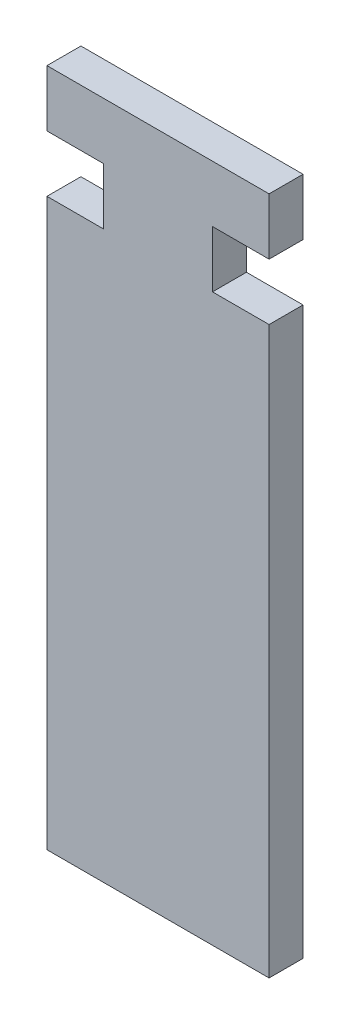
ISO-10303-21;
HEADER;
FILE_DESCRIPTION(('STEP AP214'),'2;1');
FILE_NAME('part.step','',(''),(''),'','','');
FILE_SCHEMA(('AUTOMOTIVE_DESIGN { 1 0 10303 214 1 1 1 1 }'));
ENDSEC;
DATA;
#1=APPLICATION_CONTEXT('core data for automotive mechanical design processes');
#2=APPLICATION_PROTOCOL_DEFINITION('international standard','automotive_design',2000,#1);
#3=PRODUCT_CONTEXT('',#1,'mechanical');
#4=PRODUCT('Part','Part','',(#3));
#5=PRODUCT_RELATED_PRODUCT_CATEGORY('part','',(#4));
#6=PRODUCT_DEFINITION_FORMATION('','',#4);
#7=PRODUCT_DEFINITION_CONTEXT('part definition',#1,'design');
#8=PRODUCT_DEFINITION('design','',#6,#7);
#9=PRODUCT_DEFINITION_SHAPE('','',#8);
#10=(LENGTH_UNIT() NAMED_UNIT(*) SI_UNIT(.MILLI.,.METRE.));
#11=(NAMED_UNIT(*) PLANE_ANGLE_UNIT() SI_UNIT($,.RADIAN.));
#12=(NAMED_UNIT(*) SI_UNIT($,.STERADIAN.) SOLID_ANGLE_UNIT());
#13=UNCERTAINTY_MEASURE_WITH_UNIT(LENGTH_MEASURE(1.E-05),#10,'distance_accuracy_value','');
#14=(GEOMETRIC_REPRESENTATION_CONTEXT(3) GLOBAL_UNCERTAINTY_ASSIGNED_CONTEXT((#13)) GLOBAL_UNIT_ASSIGNED_CONTEXT((#10,
#11,#12)) REPRESENTATION_CONTEXT('',''));
#15=CARTESIAN_POINT('',(0.,0.,0.));
#16=DIRECTION('',(0.,0.,1.));
#17=DIRECTION('',(1.,0.,0.));
#18=AXIS2_PLACEMENT_3D('',#15,#16,#17);
#19=CARTESIAN_POINT('',(1.57,0.,0.24));
#20=DIRECTION('',(0.,1.,0.));
#21=DIRECTION('',(-1.,0.,0.));
#22=AXIS2_PLACEMENT_3D('',#19,#20,#21);
#23=PLANE('',#22);
#24=DIRECTION('',(1.,0.,0.));
#25=VECTOR('',#24,1.);
#26=CARTESIAN_POINT('',(1.57,0.,0.));
#27=LINE('',#26,#25);
#28=CARTESIAN_POINT('',(0.,0.,0.));
#29=VERTEX_POINT('',#28);
#30=CARTESIAN_POINT('',(1.57,0.,0.));
#31=VERTEX_POINT('',#30);
#32=EDGE_CURVE('E153',#29,#31,#27,.T.);
#33=ORIENTED_EDGE('',*,*,#32,.T.);
#34=DIRECTION('',(0.,0.,-1.));
#35=VECTOR('',#34,1.);
#36=CARTESIAN_POINT('',(1.57,0.,0.24));
#37=LINE('',#36,#35);
#38=CARTESIAN_POINT('',(1.57,0.,0.24));
#39=VERTEX_POINT('',#38);
#40=EDGE_CURVE('E11',#39,#31,#37,.T.);
#41=ORIENTED_EDGE('',*,*,#40,.F.);
#42=DIRECTION('',(1.,0.,0.));
#43=VECTOR('',#42,1.);
#44=CARTESIAN_POINT('',(1.57,0.,0.24));
#45=LINE('',#44,#43);
#46=CARTESIAN_POINT('',(0.,0.,0.24));
#47=VERTEX_POINT('',#46);
#48=EDGE_CURVE('E175',#47,#39,#45,.T.);
#49=ORIENTED_EDGE('',*,*,#48,.F.);
#50=DIRECTION('',(0.,0.,-1.));
#51=VECTOR('',#50,1.);
#52=CARTESIAN_POINT('',(0.,0.,0.24));
#53=LINE('',#52,#51);
#54=EDGE_CURVE('E149',#47,#29,#53,.T.);
#55=ORIENTED_EDGE('',*,*,#54,.T.);
#56=EDGE_LOOP('',(#33,#41,#49,#55));
#57=FACE_BOUND('',#56,.T.);
#58=ADVANCED_FACE('F33',(#57),#23,.F.);
#59=CARTESIAN_POINT('',(1.57,4.,0.24));
#60=DIRECTION('',(-1.,0.,0.));
#61=DIRECTION('',(0.,0.,1.));
#62=AXIS2_PLACEMENT_3D('',#59,#60,#61);
#63=PLANE('',#62);
#64=DIRECTION('',(0.,1.,0.));
#65=VECTOR('',#64,1.);
#66=CARTESIAN_POINT('',(1.57,4.,0.));
#67=LINE('',#66,#65);
#68=CARTESIAN_POINT('',(1.57,4.,0.));
#69=VERTEX_POINT('',#68);
#70=EDGE_CURVE('E156',#31,#69,#67,.T.);
#71=ORIENTED_EDGE('',*,*,#70,.T.);
#72=DIRECTION('',(0.,0.,-1.));
#73=VECTOR('',#72,1.);
#74=CARTESIAN_POINT('',(1.57,4.,0.24));
#75=LINE('',#74,#73);
#76=CARTESIAN_POINT('',(1.57,4.,0.24));
#77=VERTEX_POINT('',#76);
#78=EDGE_CURVE('E41',#77,#69,#75,.T.);
#79=ORIENTED_EDGE('',*,*,#78,.F.);
#80=DIRECTION('',(0.,1.,0.));
#81=VECTOR('',#80,1.);
#82=CARTESIAN_POINT('',(1.57,4.,0.24));
#83=LINE('',#82,#81);
#84=EDGE_CURVE('E104',#39,#77,#83,.T.);
#85=ORIENTED_EDGE('',*,*,#84,.F.);
#86=ORIENTED_EDGE('',*,*,#40,.T.);
#87=EDGE_LOOP('',(#71,#79,#85,#86));
#88=FACE_BOUND('',#87,.T.);
#89=ADVANCED_FACE('F253',(#88),#63,.F.);
#90=CARTESIAN_POINT('',(1.17,4.,0.24));
#91=DIRECTION('',(0.,-1.,0.));
#92=DIRECTION('',(0.,0.,-1.));
#93=AXIS2_PLACEMENT_3D('',#90,#91,#92);
#94=PLANE('',#93);
#95=DIRECTION('',(-1.,0.,0.));
#96=VECTOR('',#95,1.);
#97=CARTESIAN_POINT('',(1.17,4.,0.));
#98=LINE('',#97,#96);
#99=CARTESIAN_POINT('',(1.17,4.,0.));
#100=VERTEX_POINT('',#99);
#101=EDGE_CURVE('E158',#69,#100,#98,.T.);
#102=ORIENTED_EDGE('',*,*,#101,.T.);
#103=DIRECTION('',(0.,0.,-1.));
#104=VECTOR('',#103,1.);
#105=CARTESIAN_POINT('',(1.17,4.,0.24));
#106=LINE('',#105,#104);
#107=CARTESIAN_POINT('',(1.17,4.,0.24));
#108=VERTEX_POINT('',#107);
#109=EDGE_CURVE('E194',#108,#100,#106,.T.);
#110=ORIENTED_EDGE('',*,*,#109,.F.);
#111=DIRECTION('',(-1.,0.,0.));
#112=VECTOR('',#111,1.);
#113=CARTESIAN_POINT('',(1.17,4.,0.24));
#114=LINE('',#113,#112);
#115=EDGE_CURVE('E202',#77,#108,#114,.T.);
#116=ORIENTED_EDGE('',*,*,#115,.F.);
#117=ORIENTED_EDGE('',*,*,#78,.T.);
#118=EDGE_LOOP('',(#102,#110,#116,#117));
#119=FACE_BOUND('',#118,.T.);
#120=ADVANCED_FACE('F200',(#119),#94,.F.);
#121=CARTESIAN_POINT('',(1.17,4.4,0.24));
#122=DIRECTION('',(-1.,0.,0.));
#123=DIRECTION('',(0.,0.,1.));
#124=AXIS2_PLACEMENT_3D('',#121,#122,#123);
#125=PLANE('',#124);
#126=DIRECTION('',(0.,1.,0.));
#127=VECTOR('',#126,1.);
#128=CARTESIAN_POINT('',(1.17,4.4,0.));
#129=LINE('',#128,#127);
#130=CARTESIAN_POINT('',(1.17,4.4,0.));
#131=VERTEX_POINT('',#130);
#132=EDGE_CURVE('E160',#100,#131,#129,.T.);
#133=ORIENTED_EDGE('',*,*,#132,.T.);
#134=DIRECTION('',(0.,0.,-1.));
#135=VECTOR('',#134,1.);
#136=CARTESIAN_POINT('',(1.17,4.4,0.24));
#137=LINE('',#136,#135);
#138=CARTESIAN_POINT('',(1.17,4.4,0.24));
#139=VERTEX_POINT('',#138);
#140=EDGE_CURVE('E191',#139,#131,#137,.T.);
#141=ORIENTED_EDGE('',*,*,#140,.F.);
#142=DIRECTION('',(0.,1.,0.));
#143=VECTOR('',#142,1.);
#144=CARTESIAN_POINT('',(1.17,4.4,0.24));
#145=LINE('',#144,#143);
#146=EDGE_CURVE('E220',#108,#139,#145,.T.);
#147=ORIENTED_EDGE('',*,*,#146,.F.);
#148=ORIENTED_EDGE('',*,*,#109,.T.);
#149=EDGE_LOOP('',(#133,#141,#147,#148));
#150=FACE_BOUND('',#149,.T.);
#151=ADVANCED_FACE('F211',(#150),#125,.F.);
#152=CARTESIAN_POINT('',(1.57,4.4,0.24));
#153=DIRECTION('',(0.,1.,0.));
#154=DIRECTION('',(0.,0.,1.));
#155=AXIS2_PLACEMENT_3D('',#152,#153,#154);
#156=PLANE('',#155);
#157=DIRECTION('',(1.,0.,0.));
#158=VECTOR('',#157,1.);
#159=CARTESIAN_POINT('',(1.57,4.4,0.));
#160=LINE('',#159,#158);
#161=CARTESIAN_POINT('',(1.57,4.4,0.));
#162=VERTEX_POINT('',#161);
#163=EDGE_CURVE('E162',#131,#162,#160,.T.);
#164=ORIENTED_EDGE('',*,*,#163,.T.);
#165=DIRECTION('',(0.,0.,-1.));
#166=VECTOR('',#165,1.);
#167=CARTESIAN_POINT('',(1.57,4.4,0.24));
#168=LINE('',#167,#166);
#169=CARTESIAN_POINT('',(1.57,4.4,0.24));
#170=VERTEX_POINT('',#169);
#171=EDGE_CURVE('E188',#170,#162,#168,.T.);
#172=ORIENTED_EDGE('',*,*,#171,.F.);
#173=DIRECTION('',(1.,0.,0.));
#174=VECTOR('',#173,1.);
#175=CARTESIAN_POINT('',(1.57,4.4,0.24));
#176=LINE('',#175,#174);
#177=EDGE_CURVE('E217',#139,#170,#176,.T.);
#178=ORIENTED_EDGE('',*,*,#177,.F.);
#179=ORIENTED_EDGE('',*,*,#140,.T.);
#180=EDGE_LOOP('',(#164,#172,#178,#179));
#181=FACE_BOUND('',#180,.T.);
#182=ADVANCED_FACE('F215',(#181),#156,.F.);
#183=CARTESIAN_POINT('',(1.57,4.8,0.24));
#184=DIRECTION('',(-1.,0.,0.));
#185=DIRECTION('',(0.,0.,1.));
#186=AXIS2_PLACEMENT_3D('',#183,#184,#185);
#187=PLANE('',#186);
#188=DIRECTION('',(0.,1.,0.));
#189=VECTOR('',#188,1.);
#190=CARTESIAN_POINT('',(1.57,4.8,0.));
#191=LINE('',#190,#189);
#192=CARTESIAN_POINT('',(1.57,4.8,0.));
#193=VERTEX_POINT('',#192);
#194=EDGE_CURVE('E164',#162,#193,#191,.T.);
#195=ORIENTED_EDGE('',*,*,#194,.T.);
#196=DIRECTION('',(0.,0.,-1.));
#197=VECTOR('',#196,1.);
#198=CARTESIAN_POINT('',(1.57,4.8,0.24));
#199=LINE('',#198,#197);
#200=CARTESIAN_POINT('',(1.57,4.8,0.24));
#201=VERTEX_POINT('',#200);
#202=EDGE_CURVE('E185',#201,#193,#199,.T.);
#203=ORIENTED_EDGE('',*,*,#202,.F.);
#204=DIRECTION('',(0.,1.,0.));
#205=VECTOR('',#204,1.);
#206=CARTESIAN_POINT('',(1.57,4.8,0.24));
#207=LINE('',#206,#205);
#208=EDGE_CURVE('E219',#170,#201,#207,.T.);
#209=ORIENTED_EDGE('',*,*,#208,.F.);
#210=ORIENTED_EDGE('',*,*,#171,.T.);
#211=EDGE_LOOP('',(#195,#203,#209,#210));
#212=FACE_BOUND('',#211,.T.);
#213=ADVANCED_FACE('F266',(#212),#187,.F.);
#214=CARTESIAN_POINT('',(0.,4.8,0.24));
#215=DIRECTION('',(0.,-1.,0.));
#216=DIRECTION('',(0.,0.,-1.));
#217=AXIS2_PLACEMENT_3D('',#214,#215,#216);
#218=PLANE('',#217);
#219=DIRECTION('',(-1.,0.,0.));
#220=VECTOR('',#219,1.);
#221=CARTESIAN_POINT('',(0.,4.8,0.));
#222=LINE('',#221,#220);
#223=CARTESIAN_POINT('',(0.,4.8,0.));
#224=VERTEX_POINT('',#223);
#225=EDGE_CURVE('E166',#193,#224,#222,.T.);
#226=ORIENTED_EDGE('',*,*,#225,.T.);
#227=DIRECTION('',(0.,0.,-1.));
#228=VECTOR('',#227,1.);
#229=CARTESIAN_POINT('',(0.,4.8,0.24));
#230=LINE('',#229,#228);
#231=CARTESIAN_POINT('',(0.,4.8,0.24));
#232=VERTEX_POINT('',#231);
#233=EDGE_CURVE('E182',#232,#224,#230,.T.);
#234=ORIENTED_EDGE('',*,*,#233,.F.);
#235=DIRECTION('',(-1.,0.,0.));
#236=VECTOR('',#235,1.);
#237=CARTESIAN_POINT('',(0.,4.8,0.24));
#238=LINE('',#237,#236);
#239=EDGE_CURVE('E222',#201,#232,#238,.T.);
#240=ORIENTED_EDGE('',*,*,#239,.F.);
#241=ORIENTED_EDGE('',*,*,#202,.T.);
#242=EDGE_LOOP('',(#226,#234,#240,#241));
#243=FACE_BOUND('',#242,.T.);
#244=ADVANCED_FACE('F269',(#243),#218,.F.);
#245=CARTESIAN_POINT('',(0.,4.4,0.24));
#246=DIRECTION('',(1.,0.,0.));
#247=DIRECTION('',(0.,0.,-1.));
#248=AXIS2_PLACEMENT_3D('',#245,#246,#247);
#249=PLANE('',#248);
#250=DIRECTION('',(0.,-1.,0.));
#251=VECTOR('',#250,1.);
#252=CARTESIAN_POINT('',(0.,4.4,0.));
#253=LINE('',#252,#251);
#254=CARTESIAN_POINT('',(0.,4.4,0.));
#255=VERTEX_POINT('',#254);
#256=EDGE_CURVE('E168',#224,#255,#253,.T.);
#257=ORIENTED_EDGE('',*,*,#256,.T.);
#258=DIRECTION('',(0.,0.,-1.));
#259=VECTOR('',#258,1.);
#260=CARTESIAN_POINT('',(0.,4.4,0.24));
#261=LINE('',#260,#259);
#262=CARTESIAN_POINT('',(0.,4.4,0.24));
#263=VERTEX_POINT('',#262);
#264=EDGE_CURVE('E179',#263,#255,#261,.T.);
#265=ORIENTED_EDGE('',*,*,#264,.F.);
#266=DIRECTION('',(0.,-1.,0.));
#267=VECTOR('',#266,1.);
#268=CARTESIAN_POINT('',(0.,4.4,0.24));
#269=LINE('',#268,#267);
#270=EDGE_CURVE('E228',#232,#263,#269,.T.);
#271=ORIENTED_EDGE('',*,*,#270,.F.);
#272=ORIENTED_EDGE('',*,*,#233,.T.);
#273=EDGE_LOOP('',(#257,#265,#271,#272));
#274=FACE_BOUND('',#273,.T.);
#275=ADVANCED_FACE('F234',(#274),#249,.F.);
#276=CARTESIAN_POINT('',(0.4,4.4,0.24));
#277=DIRECTION('',(0.,1.,0.));
#278=DIRECTION('',(0.,0.,1.));
#279=AXIS2_PLACEMENT_3D('',#276,#277,#278);
#280=PLANE('',#279);
#281=DIRECTION('',(1.,0.,0.));
#282=VECTOR('',#281,1.);
#283=CARTESIAN_POINT('',(0.4,4.4,0.));
#284=LINE('',#283,#282);
#285=CARTESIAN_POINT('',(0.4,4.4,0.));
#286=VERTEX_POINT('',#285);
#287=EDGE_CURVE('E170',#255,#286,#284,.T.);
#288=ORIENTED_EDGE('',*,*,#287,.T.);
#289=DIRECTION('',(0.,0.,-1.));
#290=VECTOR('',#289,1.);
#291=CARTESIAN_POINT('',(0.4,4.4,0.24));
#292=LINE('',#291,#290);
#293=CARTESIAN_POINT('',(0.4,4.4,0.24));
#294=VERTEX_POINT('',#293);
#295=EDGE_CURVE('E144',#294,#286,#292,.T.);
#296=ORIENTED_EDGE('',*,*,#295,.F.);
#297=DIRECTION('',(1.,0.,0.));
#298=VECTOR('',#297,1.);
#299=CARTESIAN_POINT('',(0.4,4.4,0.24));
#300=LINE('',#299,#298);
#301=EDGE_CURVE('E135',#263,#294,#300,.T.);
#302=ORIENTED_EDGE('',*,*,#301,.F.);
#303=ORIENTED_EDGE('',*,*,#264,.T.);
#304=EDGE_LOOP('',(#288,#296,#302,#303));
#305=FACE_BOUND('',#304,.T.);
#306=ADVANCED_FACE('F238',(#305),#280,.F.);
#307=CARTESIAN_POINT('',(0.4,4.,0.24));
#308=DIRECTION('',(1.,0.,0.));
#309=DIRECTION('',(0.,1.,0.));
#310=AXIS2_PLACEMENT_3D('',#307,#308,#309);
#311=PLANE('',#310);
#312=DIRECTION('',(0.,-1.,0.));
#313=VECTOR('',#312,1.);
#314=CARTESIAN_POINT('',(0.4,4.,0.));
#315=LINE('',#314,#313);
#316=CARTESIAN_POINT('',(0.4,4.,0.));
#317=VERTEX_POINT('',#316);
#318=EDGE_CURVE('E143',#286,#317,#315,.T.);
#319=ORIENTED_EDGE('',*,*,#318,.T.);
#320=DIRECTION('',(0.,0.,-1.));
#321=VECTOR('',#320,1.);
#322=CARTESIAN_POINT('',(0.4,4.,0.24));
#323=LINE('',#322,#321);
#324=CARTESIAN_POINT('',(0.4,4.,0.24));
#325=VERTEX_POINT('',#324);
#326=EDGE_CURVE('E140',#325,#317,#323,.T.);
#327=ORIENTED_EDGE('',*,*,#326,.F.);
#328=DIRECTION('',(0.,-1.,0.));
#329=VECTOR('',#328,1.);
#330=CARTESIAN_POINT('',(0.4,4.,0.24));
#331=LINE('',#330,#329);
#332=EDGE_CURVE('E129',#294,#325,#331,.T.);
#333=ORIENTED_EDGE('',*,*,#332,.F.);
#334=ORIENTED_EDGE('',*,*,#295,.T.);
#335=EDGE_LOOP('',(#319,#327,#333,#334));
#336=FACE_BOUND('',#335,.T.);
#337=ADVANCED_FACE('F141',(#336),#311,.F.);
#338=CARTESIAN_POINT('',(0.,4.,0.24));
#339=DIRECTION('',(0.,-1.,0.));
#340=DIRECTION('',(0.,0.,-1.));
#341=AXIS2_PLACEMENT_3D('',#338,#339,#340);
#342=PLANE('',#341);
#343=DIRECTION('',(-1.,0.,0.));
#344=VECTOR('',#343,1.);
#345=CARTESIAN_POINT('',(0.,4.,0.));
#346=LINE('',#345,#344);
#347=CARTESIAN_POINT('',(0.,4.,0.));
#348=VERTEX_POINT('',#347);
#349=EDGE_CURVE('E90',#317,#348,#346,.T.);
#350=ORIENTED_EDGE('',*,*,#349,.T.);
#351=DIRECTION('',(0.,0.,-1.));
#352=VECTOR('',#351,1.);
#353=CARTESIAN_POINT('',(0.,4.,0.24));
#354=LINE('',#353,#352);
#355=CARTESIAN_POINT('',(0.,4.,0.24));
#356=VERTEX_POINT('',#355);
#357=EDGE_CURVE('E145',#356,#348,#354,.T.);
#358=ORIENTED_EDGE('',*,*,#357,.F.);
#359=DIRECTION('',(-1.,0.,0.));
#360=VECTOR('',#359,1.);
#361=CARTESIAN_POINT('',(0.,4.,0.24));
#362=LINE('',#361,#360);
#363=EDGE_CURVE('E133',#325,#356,#362,.T.);
#364=ORIENTED_EDGE('',*,*,#363,.F.);
#365=ORIENTED_EDGE('',*,*,#326,.T.);
#366=EDGE_LOOP('',(#350,#358,#364,#365));
#367=FACE_BOUND('',#366,.T.);
#368=ADVANCED_FACE('F147',(#367),#342,.F.);
#369=CARTESIAN_POINT('',(0.,0.,0.24));
#370=DIRECTION('',(1.,0.,0.));
#371=DIRECTION('',(0.,0.,-1.));
#372=AXIS2_PLACEMENT_3D('',#369,#370,#371);
#373=PLANE('',#372);
#374=DIRECTION('',(0.,-1.,0.));
#375=VECTOR('',#374,1.);
#376=CARTESIAN_POINT('',(0.,0.,0.));
#377=LINE('',#376,#375);
#378=EDGE_CURVE('E96',#348,#29,#377,.T.);
#379=ORIENTED_EDGE('',*,*,#378,.T.);
#380=ORIENTED_EDGE('',*,*,#54,.F.);
#381=DIRECTION('',(0.,-1.,0.));
#382=VECTOR('',#381,1.);
#383=CARTESIAN_POINT('',(0.,0.,0.24));
#384=LINE('',#383,#382);
#385=EDGE_CURVE('E49',#356,#47,#384,.T.);
#386=ORIENTED_EDGE('',*,*,#385,.F.);
#387=ORIENTED_EDGE('',*,*,#357,.T.);
#388=EDGE_LOOP('',(#379,#380,#386,#387));
#389=FACE_BOUND('',#388,.T.);
#390=ADVANCED_FACE('F242',(#389),#373,.F.);
#391=CARTESIAN_POINT('',(0.,0.,0.24));
#392=DIRECTION('',(0.,0.,-1.));
#393=DIRECTION('',(-1.,0.,0.));
#394=AXIS2_PLACEMENT_3D('',#391,#392,#393);
#395=PLANE('',#394);
#396=ORIENTED_EDGE('',*,*,#48,.T.);
#397=ORIENTED_EDGE('',*,*,#84,.T.);
#398=ORIENTED_EDGE('',*,*,#115,.T.);
#399=ORIENTED_EDGE('',*,*,#146,.T.);
#400=ORIENTED_EDGE('',*,*,#177,.T.);
#401=ORIENTED_EDGE('',*,*,#208,.T.);
#402=ORIENTED_EDGE('',*,*,#239,.T.);
#403=ORIENTED_EDGE('',*,*,#270,.T.);
#404=ORIENTED_EDGE('',*,*,#301,.T.);
#405=ORIENTED_EDGE('',*,*,#332,.T.);
#406=ORIENTED_EDGE('',*,*,#363,.T.);
#407=ORIENTED_EDGE('',*,*,#385,.T.);
#408=EDGE_LOOP('',(#396,#397,#398,#399,#400,#401,#402,#403,#404,#405,#406,#407));
#409=FACE_BOUND('',#408,.T.);
#410=ADVANCED_FACE('F131',(#409),#395,.F.);
#411=CARTESIAN_POINT('',(0.,0.,0.));
#412=DIRECTION('',(0.,0.,-1.));
#413=DIRECTION('',(-1.,0.,0.));
#414=AXIS2_PLACEMENT_3D('',#411,#412,#413);
#415=PLANE('',#414);
#416=ORIENTED_EDGE('',*,*,#32,.F.);
#417=ORIENTED_EDGE('',*,*,#378,.F.);
#418=ORIENTED_EDGE('',*,*,#349,.F.);
#419=ORIENTED_EDGE('',*,*,#318,.F.);
#420=ORIENTED_EDGE('',*,*,#287,.F.);
#421=ORIENTED_EDGE('',*,*,#256,.F.);
#422=ORIENTED_EDGE('',*,*,#225,.F.);
#423=ORIENTED_EDGE('',*,*,#194,.F.);
#424=ORIENTED_EDGE('',*,*,#163,.F.);
#425=ORIENTED_EDGE('',*,*,#132,.F.);
#426=ORIENTED_EDGE('',*,*,#101,.F.);
#427=ORIENTED_EDGE('',*,*,#70,.F.);
#428=EDGE_LOOP('',(#416,#417,#418,#419,#420,#421,#422,#423,#424,#425,#426,#427));
#429=FACE_BOUND('',#428,.T.);
#430=ADVANCED_FACE('F206',(#429),#415,.T.);
#431=CLOSED_SHELL('',(#58,#89,#120,#151,#182,#213,#244,#275,#306,#337,#368,#390,#410,#430));
#432=MANIFOLD_SOLID_BREP('B2',#431);
#433=ADVANCED_BREP_SHAPE_REPRESENTATION('',(#18,#432),#14);
#434=SHAPE_DEFINITION_REPRESENTATION(#9,#433);
ENDSEC;
END-ISO-10303-21;
